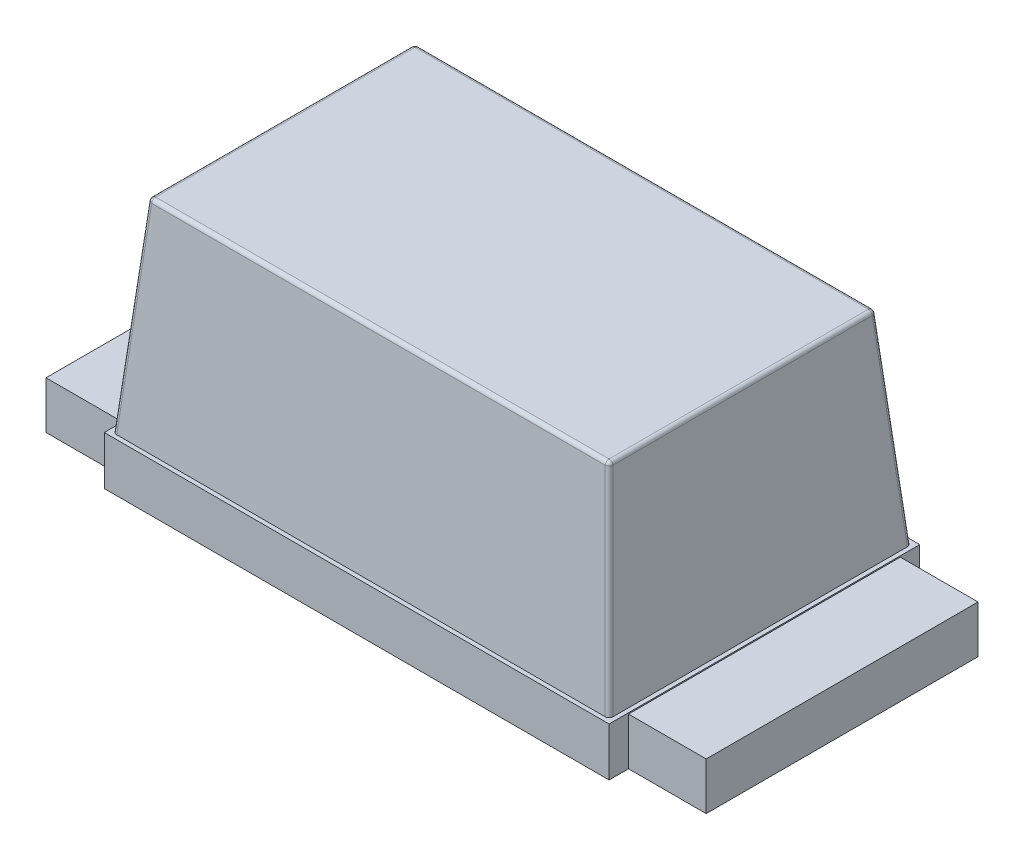
ISO-10303-21;
HEADER;
FILE_DESCRIPTION(('STEP AP214'),'2;1');
FILE_NAME('part.step','',(''),(''),'','','');
FILE_SCHEMA(('AUTOMOTIVE_DESIGN { 1 0 10303 214 1 1 1 1 }'));
ENDSEC;
DATA;
#1=APPLICATION_CONTEXT('core data for automotive mechanical design processes');
#2=APPLICATION_PROTOCOL_DEFINITION('international standard','automotive_design',2000,#1);
#3=PRODUCT_CONTEXT('',#1,'mechanical');
#4=PRODUCT('Part','Part','',(#3));
#5=PRODUCT_RELATED_PRODUCT_CATEGORY('part','',(#4));
#6=PRODUCT_DEFINITION_FORMATION('','',#4);
#7=PRODUCT_DEFINITION_CONTEXT('part definition',#1,'design');
#8=PRODUCT_DEFINITION('design','',#6,#7);
#9=PRODUCT_DEFINITION_SHAPE('','',#8);
#10=(LENGTH_UNIT() NAMED_UNIT(*) SI_UNIT(.MILLI.,.METRE.));
#11=(NAMED_UNIT(*) PLANE_ANGLE_UNIT() SI_UNIT($,.RADIAN.));
#12=(NAMED_UNIT(*) SI_UNIT($,.STERADIAN.) SOLID_ANGLE_UNIT());
#13=UNCERTAINTY_MEASURE_WITH_UNIT(LENGTH_MEASURE(1.E-05),#10,'distance_accuracy_value','');
#14=(GEOMETRIC_REPRESENTATION_CONTEXT(3) GLOBAL_UNCERTAINTY_ASSIGNED_CONTEXT((#13)) GLOBAL_UNIT_ASSIGNED_CONTEXT((#10,
#11,#12)) REPRESENTATION_CONTEXT('',''));
#15=CARTESIAN_POINT('',(0.,0.,0.));
#16=DIRECTION('',(0.,0.,1.));
#17=DIRECTION('',(1.,0.,0.));
#18=AXIS2_PLACEMENT_3D('',#15,#16,#17);
#19=CARTESIAN_POINT('',(1.3,0.125,0.));
#20=DIRECTION('',(-1.,0.,0.));
#21=DIRECTION('',(0.,0.,1.));
#22=AXIS2_PLACEMENT_3D('',#19,#20,#21);
#23=PLANE('',#22);
#24=DIRECTION('',(0.,-1.,0.));
#25=VECTOR('',#24,1.);
#26=CARTESIAN_POINT('',(1.3,0.122,-0.05));
#27=LINE('',#26,#25);
#28=CARTESIAN_POINT('',(1.3,0.122,-0.05));
#29=VERTEX_POINT('',#28);
#30=CARTESIAN_POINT('',(1.3,0.,-0.05));
#31=VERTEX_POINT('',#30);
#32=EDGE_CURVE('E11',#29,#31,#27,.T.);
#33=ORIENTED_EDGE('',*,*,#32,.F.);
#34=DIRECTION('',(0.,0.,1.));
#35=VECTOR('',#34,1.);
#36=CARTESIAN_POINT('',(1.3,0.122,-0.424380225030963));
#37=LINE('',#36,#35);
#38=CARTESIAN_POINT('',(1.3,0.122,-0.75));
#39=VERTEX_POINT('',#38);
#40=EDGE_CURVE('E24',#39,#29,#37,.T.);
#41=ORIENTED_EDGE('',*,*,#40,.F.);
#42=DIRECTION('',(0.,-1.,0.));
#43=VECTOR('',#42,1.);
#44=CARTESIAN_POINT('',(1.3,0.122,-0.75));
#45=LINE('',#44,#43);
#46=CARTESIAN_POINT('',(1.3,0.,-0.75));
#47=VERTEX_POINT('',#46);
#48=EDGE_CURVE('E342',#39,#47,#45,.T.);
#49=ORIENTED_EDGE('',*,*,#48,.T.);
#50=DIRECTION('',(0.,0.,-1.));
#51=VECTOR('',#50,1.);
#52=CARTESIAN_POINT('',(1.3,0.,0.));
#53=LINE('',#52,#51);
#54=CARTESIAN_POINT('',(1.3,0.,-0.799999999999999));
#55=VERTEX_POINT('',#54);
#56=EDGE_CURVE('E340',#47,#55,#53,.T.);
#57=ORIENTED_EDGE('',*,*,#56,.T.);
#58=DIRECTION('',(0.,-1.,0.));
#59=VECTOR('',#58,1.);
#60=CARTESIAN_POINT('',(1.3,0.125,-0.799999999999999));
#61=LINE('',#60,#59);
#62=CARTESIAN_POINT('',(1.3,0.125,-0.799999999999999));
#63=VERTEX_POINT('',#62);
#64=EDGE_CURVE('E337',#63,#55,#61,.T.);
#65=ORIENTED_EDGE('',*,*,#64,.F.);
#66=DIRECTION('',(0.,0.,-1.));
#67=VECTOR('',#66,1.);
#68=CARTESIAN_POINT('',(1.3,0.125,0.));
#69=LINE('',#68,#67);
#70=CARTESIAN_POINT('',(1.3,0.125,0.));
#71=VERTEX_POINT('',#70);
#72=EDGE_CURVE('E334',#71,#63,#69,.T.);
#73=ORIENTED_EDGE('',*,*,#72,.F.);
#74=DIRECTION('',(0.,-1.,0.));
#75=VECTOR('',#74,1.);
#76=CARTESIAN_POINT('',(1.3,0.125,0.));
#77=LINE('',#76,#75);
#78=CARTESIAN_POINT('',(1.3,0.,0.));
#79=VERTEX_POINT('',#78);
#80=EDGE_CURVE('E332',#71,#79,#77,.T.);
#81=ORIENTED_EDGE('',*,*,#80,.T.);
#82=DIRECTION('',(0.,0.,-1.));
#83=VECTOR('',#82,1.);
#84=CARTESIAN_POINT('',(1.3,0.,0.));
#85=LINE('',#84,#83);
#86=EDGE_CURVE('E330',#79,#31,#85,.T.);
#87=ORIENTED_EDGE('',*,*,#86,.T.);
#88=EDGE_LOOP('',(#33,#41,#49,#57,#65,#73,#81,#87));
#89=FACE_BOUND('',#88,.T.);
#90=ADVANCED_FACE('F17',(#89),#23,.F.);
#91=CARTESIAN_POINT('',(0.,0.125,0.));
#92=DIRECTION('',(1.,0.,0.));
#93=DIRECTION('',(0.,0.,-1.));
#94=AXIS2_PLACEMENT_3D('',#91,#92,#93);
#95=PLANE('',#94);
#96=DIRECTION('',(0.,-1.,0.));
#97=VECTOR('',#96,1.);
#98=CARTESIAN_POINT('',(0.,0.122,-0.75));
#99=LINE('',#98,#97);
#100=CARTESIAN_POINT('',(0.,0.122,-0.75));
#101=VERTEX_POINT('',#100);
#102=CARTESIAN_POINT('',(0.,0.,-0.75));
#103=VERTEX_POINT('',#102);
#104=EDGE_CURVE('E328',#101,#103,#99,.T.);
#105=ORIENTED_EDGE('',*,*,#104,.F.);
#106=DIRECTION('',(0.,0.,1.));
#107=VECTOR('',#106,1.);
#108=CARTESIAN_POINT('',(0.,0.122,-0.424380225030963));
#109=LINE('',#108,#107);
#110=CARTESIAN_POINT('',(0.,0.122,-0.0500000000000001));
#111=VERTEX_POINT('',#110);
#112=EDGE_CURVE('E326',#101,#111,#109,.T.);
#113=ORIENTED_EDGE('',*,*,#112,.T.);
#114=DIRECTION('',(0.,-1.,0.));
#115=VECTOR('',#114,1.);
#116=CARTESIAN_POINT('',(0.,0.122,-0.0500000000000001));
#117=LINE('',#116,#115);
#118=CARTESIAN_POINT('',(0.,0.,-0.05));
#119=VERTEX_POINT('',#118);
#120=EDGE_CURVE('E324',#111,#119,#117,.T.);
#121=ORIENTED_EDGE('',*,*,#120,.T.);
#122=DIRECTION('',(0.,0.,1.));
#123=VECTOR('',#122,1.);
#124=CARTESIAN_POINT('',(0.,0.,0.));
#125=LINE('',#124,#123);
#126=CARTESIAN_POINT('',(0.,0.,0.));
#127=VERTEX_POINT('',#126);
#128=EDGE_CURVE('E322',#119,#127,#125,.T.);
#129=ORIENTED_EDGE('',*,*,#128,.T.);
#130=DIRECTION('',(0.,-1.,0.));
#131=VECTOR('',#130,1.);
#132=CARTESIAN_POINT('',(0.,0.125,0.));
#133=LINE('',#132,#131);
#134=CARTESIAN_POINT('',(0.,0.125,0.));
#135=VERTEX_POINT('',#134);
#136=EDGE_CURVE('E319',#135,#127,#133,.T.);
#137=ORIENTED_EDGE('',*,*,#136,.F.);
#138=DIRECTION('',(0.,0.,1.));
#139=VECTOR('',#138,1.);
#140=CARTESIAN_POINT('',(0.,0.125,0.));
#141=LINE('',#140,#139);
#142=CARTESIAN_POINT('',(0.,0.125,-0.799999999999999));
#143=VERTEX_POINT('',#142);
#144=EDGE_CURVE('E316',#143,#135,#141,.T.);
#145=ORIENTED_EDGE('',*,*,#144,.F.);
#146=DIRECTION('',(0.,-1.,0.));
#147=VECTOR('',#146,1.);
#148=CARTESIAN_POINT('',(0.,0.125,-0.799999999999999));
#149=LINE('',#148,#147);
#150=CARTESIAN_POINT('',(0.,0.,-0.799999999999999));
#151=VERTEX_POINT('',#150);
#152=EDGE_CURVE('E314',#143,#151,#149,.T.);
#153=ORIENTED_EDGE('',*,*,#152,.T.);
#154=DIRECTION('',(0.,0.,1.));
#155=VECTOR('',#154,1.);
#156=CARTESIAN_POINT('',(0.,0.,0.));
#157=LINE('',#156,#155);
#158=EDGE_CURVE('E311',#151,#103,#157,.T.);
#159=ORIENTED_EDGE('',*,*,#158,.T.);
#160=EDGE_LOOP('',(#105,#113,#121,#129,#137,#145,#153,#159));
#161=FACE_BOUND('',#160,.T.);
#162=ADVANCED_FACE('F362',(#161),#95,.F.);
#163=CARTESIAN_POINT('',(0.,0.125,0.));
#164=DIRECTION('',(0.,0.,-1.));
#165=DIRECTION('',(-1.,0.,0.));
#166=AXIS2_PLACEMENT_3D('',#163,#164,#165);
#167=PLANE('',#166);
#168=DIRECTION('',(1.,0.,0.));
#169=VECTOR('',#168,1.);
#170=CARTESIAN_POINT('',(0.,0.,0.));
#171=LINE('',#170,#169);
#172=EDGE_CURVE('E308',#127,#79,#171,.T.);
#173=ORIENTED_EDGE('',*,*,#172,.T.);
#174=ORIENTED_EDGE('',*,*,#80,.F.);
#175=DIRECTION('',(1.,0.,0.));
#176=VECTOR('',#175,1.);
#177=CARTESIAN_POINT('',(0.,0.125,0.));
#178=LINE('',#177,#176);
#179=EDGE_CURVE('E305',#135,#71,#178,.T.);
#180=ORIENTED_EDGE('',*,*,#179,.F.);
#181=ORIENTED_EDGE('',*,*,#136,.T.);
#182=EDGE_LOOP('',(#173,#174,#180,#181));
#183=FACE_BOUND('',#182,.T.);
#184=ADVANCED_FACE('F366',(#183),#167,.F.);
#185=CARTESIAN_POINT('',(0.,0.125,-0.799999999999999));
#186=DIRECTION('',(0.,0.,1.));
#187=DIRECTION('',(1.,0.,0.));
#188=AXIS2_PLACEMENT_3D('',#185,#186,#187);
#189=PLANE('',#188);
#190=DIRECTION('',(-1.,0.,0.));
#191=VECTOR('',#190,1.);
#192=CARTESIAN_POINT('',(0.,0.,-0.799999999999999));
#193=LINE('',#192,#191);
#194=EDGE_CURVE('E302',#55,#151,#193,.T.);
#195=ORIENTED_EDGE('',*,*,#194,.T.);
#196=ORIENTED_EDGE('',*,*,#152,.F.);
#197=DIRECTION('',(-1.,0.,0.));
#198=VECTOR('',#197,1.);
#199=CARTESIAN_POINT('',(0.,0.125,-0.799999999999999));
#200=LINE('',#199,#198);
#201=EDGE_CURVE('E299',#63,#143,#200,.T.);
#202=ORIENTED_EDGE('',*,*,#201,.F.);
#203=ORIENTED_EDGE('',*,*,#64,.T.);
#204=EDGE_LOOP('',(#195,#196,#202,#203));
#205=FACE_BOUND('',#204,.T.);
#206=ADVANCED_FACE('F371',(#205),#189,.F.);
#207=CARTESIAN_POINT('',(0.,0.125,-0.799999999999999));
#208=DIRECTION('',(0.,-1.,0.));
#209=DIRECTION('',(0.,0.,-1.));
#210=AXIS2_PLACEMENT_3D('',#207,#208,#209);
#211=PLANE('',#210);
#212=DIRECTION('',(0.,0.,-1.));
#213=VECTOR('',#212,1.);
#214=CARTESIAN_POINT('',(1.289,0.125,-0.788999999999999));
#215=LINE('',#214,#213);
#216=CARTESIAN_POINT('',(1.289,0.125,-0.0209619469809176));
#217=VERTEX_POINT('',#216);
#218=CARTESIAN_POINT('',(1.289,0.125,-0.779038053019081));
#219=VERTEX_POINT('',#218);
#220=EDGE_CURVE('E294',#217,#219,#215,.T.);
#221=ORIENTED_EDGE('',*,*,#220,.F.);
#222=CARTESIAN_POINT('',(1.289,0.125,-0.0209619469809176));
#223=CARTESIAN_POINT('',(1.289,0.125,-0.015117230643747));
#224=CARTESIAN_POINT('',(1.28488276935626,0.125,-0.0110000000000001));
#225=CARTESIAN_POINT('',(1.27903805301909,0.125,-0.0110000000000002));
#226=(BOUNDED_CURVE() B_SPLINE_CURVE(3,(#222,#223,#224,#225),.UNSPECIFIED.,.F.,
.F.) B_SPLINE_CURVE_WITH_KNOTS((4,4),(2.35999258846562,3.92319271871396),
.UNSPECIFIED.) CURVE() GEOMETRIC_REPRESENTATION_ITEM() RATIONAL_B_SPLINE_CURVE((1.,
0.806524890385347,0.806524890385347,1.)) REPRESENTATION_ITEM(''));
#227=CARTESIAN_POINT('',(1.27903805301909,0.125,-0.0110000000000002));
#228=VERTEX_POINT('',#227);
#229=EDGE_CURVE('E290',#217,#228,#226,.T.);
#230=ORIENTED_EDGE('',*,*,#229,.T.);
#231=DIRECTION('',(1.,0.,0.));
#232=VECTOR('',#231,1.);
#233=CARTESIAN_POINT('',(0.011,0.125,-0.011));
#234=LINE('',#233,#232);
#235=CARTESIAN_POINT('',(0.0209619469809174,0.125,-0.011));
#236=VERTEX_POINT('',#235);
#237=EDGE_CURVE('E284',#236,#228,#234,.T.);
#238=ORIENTED_EDGE('',*,*,#237,.F.);
#239=CARTESIAN_POINT('',(0.0209619469809174,0.125,-0.011));
#240=CARTESIAN_POINT('',(0.0151172306437469,0.125,-0.011));
#241=CARTESIAN_POINT('',(0.011,0.125,-0.0151172306437468));
#242=CARTESIAN_POINT('',(0.011,0.125,-0.0209619469809174));
#243=(BOUNDED_CURVE() B_SPLINE_CURVE(3,(#239,#240,#241,#242),.UNSPECIFIED.,.F.,
.F.) B_SPLINE_CURVE_WITH_KNOTS((4,4),(2.35999258846563,3.92319271871396),
.UNSPECIFIED.) CURVE() GEOMETRIC_REPRESENTATION_ITEM() RATIONAL_B_SPLINE_CURVE((1.,
0.806524890385349,0.806524890385349,1.)) REPRESENTATION_ITEM(''));
#244=CARTESIAN_POINT('',(0.011,0.125,-0.0209619469809174));
#245=VERTEX_POINT('',#244);
#246=EDGE_CURVE('E280',#236,#245,#243,.T.);
#247=ORIENTED_EDGE('',*,*,#246,.T.);
#248=DIRECTION('',(0.,0.,1.));
#249=VECTOR('',#248,1.);
#250=CARTESIAN_POINT('',(0.011,0.125,-0.788999999999999));
#251=LINE('',#250,#249);
#252=CARTESIAN_POINT('',(0.011,0.125,-0.779038053019081));
#253=VERTEX_POINT('',#252);
#254=EDGE_CURVE('E274',#253,#245,#251,.T.);
#255=ORIENTED_EDGE('',*,*,#254,.F.);
#256=CARTESIAN_POINT('',(0.011,0.125,-0.779038053019081));
#257=CARTESIAN_POINT('',(0.011,0.125,-0.784882769356252));
#258=CARTESIAN_POINT('',(0.0151172306437469,0.125,-0.788999999999999));
#259=CARTESIAN_POINT('',(0.0209619469809174,0.125,-0.788999999999999));
#260=(BOUNDED_CURVE() B_SPLINE_CURVE(3,(#256,#257,#258,#259),.UNSPECIFIED.,.F.,
.F.) B_SPLINE_CURVE_WITH_KNOTS((4,4),(2.35999258846562,3.92319271871396),
.UNSPECIFIED.) CURVE() GEOMETRIC_REPRESENTATION_ITEM() RATIONAL_B_SPLINE_CURVE((1.,
0.806524890385348,0.806524890385348,1.)) REPRESENTATION_ITEM(''));
#261=CARTESIAN_POINT('',(0.0209619469809174,0.125,-0.788999999999999));
#262=VERTEX_POINT('',#261);
#263=EDGE_CURVE('E270',#253,#262,#260,.T.);
#264=ORIENTED_EDGE('',*,*,#263,.T.);
#265=DIRECTION('',(-1.,0.,0.));
#266=VECTOR('',#265,1.);
#267=CARTESIAN_POINT('',(0.011,0.125,-0.788999999999999));
#268=LINE('',#267,#266);
#269=CARTESIAN_POINT('',(1.27903805301909,0.125,-0.788999999999999));
#270=VERTEX_POINT('',#269);
#271=EDGE_CURVE('E264',#270,#262,#268,.T.);
#272=ORIENTED_EDGE('',*,*,#271,.F.);
#273=CARTESIAN_POINT('',(1.27903805301909,0.125,-0.788999999999999));
#274=CARTESIAN_POINT('',(1.28488276935626,0.125,-0.788999999999999));
#275=CARTESIAN_POINT('',(1.289,0.125,-0.784882769356252));
#276=CARTESIAN_POINT('',(1.289,0.125,-0.779038053019081));
#277=(BOUNDED_CURVE() B_SPLINE_CURVE(3,(#273,#274,#275,#276),.UNSPECIFIED.,.F.,
.F.) B_SPLINE_CURVE_WITH_KNOTS((4,4),(2.35999258846562,3.92319271871396),
.UNSPECIFIED.) CURVE() GEOMETRIC_REPRESENTATION_ITEM() RATIONAL_B_SPLINE_CURVE((1.,
0.806524890385347,0.806524890385347,1.)) REPRESENTATION_ITEM(''));
#278=EDGE_CURVE('E259',#270,#219,#277,.T.);
#279=ORIENTED_EDGE('',*,*,#278,.T.);
#280=EDGE_LOOP('',(#221,#230,#238,#247,#255,#264,#272,#279));
#281=FACE_BOUND('',#280,.T.);
#282=ORIENTED_EDGE('',*,*,#144,.T.);
#283=ORIENTED_EDGE('',*,*,#179,.T.);
#284=ORIENTED_EDGE('',*,*,#72,.T.);
#285=ORIENTED_EDGE('',*,*,#201,.T.);
#286=EDGE_LOOP('',(#282,#283,#284,#285));
#287=FACE_BOUND('',#286,.T.);
#288=ADVANCED_FACE('F377',(#281,#287),#211,.F.);
#289=CARTESIAN_POINT('',(0.,0.,-0.799999999999999));
#290=DIRECTION('',(0.,-1.,0.));
#291=DIRECTION('',(0.,0.,-1.));
#292=AXIS2_PLACEMENT_3D('',#289,#290,#291);
#293=PLANE('',#292);
#294=ORIENTED_EDGE('',*,*,#158,.F.);
#295=ORIENTED_EDGE('',*,*,#194,.F.);
#296=ORIENTED_EDGE('',*,*,#56,.F.);
#297=DIRECTION('',(-1.,0.,0.));
#298=VECTOR('',#297,1.);
#299=CARTESIAN_POINT('',(-0.937065960260598,0.,-0.75));
#300=LINE('',#299,#298);
#301=CARTESIAN_POINT('',(1.5,0.,-0.75));
#302=VERTEX_POINT('',#301);
#303=EDGE_CURVE('E256',#302,#47,#300,.T.);
#304=ORIENTED_EDGE('',*,*,#303,.F.);
#305=DIRECTION('',(0.,0.,1.));
#306=VECTOR('',#305,1.);
#307=CARTESIAN_POINT('',(1.5,0.,-0.424380225030963));
#308=LINE('',#307,#306);
#309=CARTESIAN_POINT('',(1.5,0.,-0.05));
#310=VERTEX_POINT('',#309);
#311=EDGE_CURVE('E254',#302,#310,#308,.T.);
#312=ORIENTED_EDGE('',*,*,#311,.T.);
#313=DIRECTION('',(1.,0.,0.));
#314=VECTOR('',#313,1.);
#315=CARTESIAN_POINT('',(-0.937065960260598,0.,-0.0500000000000004));
#316=LINE('',#315,#314);
#317=EDGE_CURVE('E177',#31,#310,#316,.T.);
#318=ORIENTED_EDGE('',*,*,#317,.F.);
#319=ORIENTED_EDGE('',*,*,#86,.F.);
#320=ORIENTED_EDGE('',*,*,#172,.F.);
#321=ORIENTED_EDGE('',*,*,#128,.F.);
#322=DIRECTION('',(-1.,0.,0.));
#323=VECTOR('',#322,1.);
#324=CARTESIAN_POINT('',(-0.937065960260598,0.,-0.0499999999999999));
#325=LINE('',#324,#323);
#326=CARTESIAN_POINT('',(-0.2,0.,-0.05));
#327=VERTEX_POINT('',#326);
#328=EDGE_CURVE('E251',#119,#327,#325,.T.);
#329=ORIENTED_EDGE('',*,*,#328,.T.);
#330=DIRECTION('',(0.,0.,1.));
#331=VECTOR('',#330,1.);
#332=CARTESIAN_POINT('',(-0.2,0.,-0.424380225030963));
#333=LINE('',#332,#331);
#334=CARTESIAN_POINT('',(-0.2,0.,-0.75));
#335=VERTEX_POINT('',#334);
#336=EDGE_CURVE('E248',#335,#327,#333,.T.);
#337=ORIENTED_EDGE('',*,*,#336,.F.);
#338=DIRECTION('',(1.,0.,0.));
#339=VECTOR('',#338,1.);
#340=CARTESIAN_POINT('',(-0.937065960260598,0.,-0.75));
#341=LINE('',#340,#339);
#342=EDGE_CURVE('E245',#335,#103,#341,.T.);
#343=ORIENTED_EDGE('',*,*,#342,.T.);
#344=EDGE_LOOP('',(#294,#295,#296,#304,#312,#318,#319,#320,#321,#329,#337,#343));
#345=FACE_BOUND('',#344,.T.);
#346=ADVANCED_FACE('F349',(#345),#293,.T.);
#347=CARTESIAN_POINT('',(0.011,0.65,-0.011));
#348=DIRECTION('',(0.,1.,0.));
#349=DIRECTION('',(0.,0.,1.));
#350=AXIS2_PLACEMENT_3D('',#347,#348,#349);
#351=PLANE('',#350);
#352=DIRECTION('',(0.,0.,-1.));
#353=VECTOR('',#352,1.);
#354=CARTESIAN_POINT('',(1.23390513990872,0.65,-0.011));
#355=LINE('',#354,#353);
#356=CARTESIAN_POINT('',(1.23390513990872,0.65,-0.0660948600912845));
#357=VERTEX_POINT('',#356);
#358=CARTESIAN_POINT('',(1.23390513990872,0.65,-0.733905139908714));
#359=VERTEX_POINT('',#358);
#360=EDGE_CURVE('E243',#357,#359,#355,.T.);
#361=ORIENTED_EDGE('',*,*,#360,.T.);
#362=DIRECTION('',(-1.,0.,0.));
#363=VECTOR('',#362,1.);
#364=CARTESIAN_POINT('',(0.0109999999999999,0.65,-0.733905139908714));
#365=LINE('',#364,#363);
#366=CARTESIAN_POINT('',(0.0660948600912843,0.65,-0.733905139908714));
#367=VERTEX_POINT('',#366);
#368=EDGE_CURVE('E241',#359,#367,#365,.T.);
#369=ORIENTED_EDGE('',*,*,#368,.T.);
#370=DIRECTION('',(0.,0.,1.));
#371=VECTOR('',#370,1.);
#372=CARTESIAN_POINT('',(0.0660948600912843,0.65,-0.011));
#373=LINE('',#372,#371);
#374=CARTESIAN_POINT('',(0.0660948600912843,0.65,-0.0660948600912843));
#375=VERTEX_POINT('',#374);
#376=EDGE_CURVE('E239',#367,#375,#373,.T.);
#377=ORIENTED_EDGE('',*,*,#376,.T.);
#378=DIRECTION('',(1.,0.,0.));
#379=VECTOR('',#378,1.);
#380=CARTESIAN_POINT('',(0.011,0.65,-0.0660948600912843));
#381=LINE('',#380,#379);
#382=EDGE_CURVE('E236',#375,#357,#381,.T.);
#383=ORIENTED_EDGE('',*,*,#382,.T.);
#384=EDGE_LOOP('',(#361,#369,#377,#383));
#385=FACE_BOUND('',#384,.T.);
#386=ADVANCED_FACE('F384',(#385),#351,.T.);
#387=CARTESIAN_POINT('',(0.011,0.125,-0.011));
#388=DIRECTION('',(0.,0.0871557427476582,0.996194698091746));
#389=DIRECTION('',(0.,-0.996194698091746,0.0871557427476582));
#390=AXIS2_PLACEMENT_3D('',#387,#388,#389);
#391=PLANE('',#390);
#392=ORIENTED_EDGE('',*,*,#237,.T.);
#393=DIRECTION('',(-0.0868265938642476,0.992432509138967,-0.0868265938642476));
#394=VECTOR('',#393,1.);
#395=CARTESIAN_POINT('',(1.26947849495698,0.23426624864115,-0.0205595580621057));
#396=LINE('',#395,#394);
#397=CARTESIAN_POINT('',(1.23390513990872,0.640871557427477,-0.056132913110367));
#398=VERTEX_POINT('',#397);
#399=EDGE_CURVE('E234',#228,#398,#396,.T.);
#400=ORIENTED_EDGE('',*,*,#399,.T.);
#401=DIRECTION('',(-1.,0.,0.));
#402=VECTOR('',#401,1.);
#403=CARTESIAN_POINT('',(0.011,0.640871557427477,-0.0561329131103669));
#404=LINE('',#403,#402);
#405=CARTESIAN_POINT('',(0.0660948600912843,0.640871557427477,-0.0561329131103669));
#406=VERTEX_POINT('',#405);
#407=EDGE_CURVE('E232',#398,#406,#404,.T.);
#408=ORIENTED_EDGE('',*,*,#407,.T.);
#409=DIRECTION('',(-0.0868265938642476,-0.992432509138967,0.0868265938642476));
#410=VECTOR('',#409,1.);
#411=CARTESIAN_POINT('',(0.0208868452831814,0.12414158366685,-0.0109248983022639));
#412=LINE('',#411,#410);
#413=EDGE_CURVE('E229',#406,#236,#412,.T.);
#414=ORIENTED_EDGE('',*,*,#413,.T.);
#415=EDGE_LOOP('',(#392,#400,#408,#414));
#416=FACE_BOUND('',#415,.T.);
#417=ADVANCED_FACE('F387',(#416),#391,.T.);
#418=CARTESIAN_POINT('',(1.289,0.125,-0.788999999999999));
#419=DIRECTION('',(0.996194698091746,0.0871557427476582,0.));
#420=DIRECTION('',(-0.0871557427476582,0.996194698091746,0.));
#421=AXIS2_PLACEMENT_3D('',#418,#419,#420);
#422=PLANE('',#421);
#423=DIRECTION('',(0.,0.,1.));
#424=VECTOR('',#423,1.);
#425=CARTESIAN_POINT('',(1.24386708688964,0.640871557427477,-0.788999999999999));
#426=LINE('',#425,#424);
#427=CARTESIAN_POINT('',(1.24386708688964,0.640871557427477,-0.733905139908714));
#428=VERTEX_POINT('',#427);
#429=CARTESIAN_POINT('',(1.24386708688964,0.640871557427477,-0.0660948600912845));
#430=VERTEX_POINT('',#429);
#431=EDGE_CURVE('E227',#428,#430,#426,.T.);
#432=ORIENTED_EDGE('',*,*,#431,.T.);
#433=DIRECTION('',(0.0868265938642476,-0.992432509138967,0.0868265938642476));
#434=VECTOR('',#433,1.);
#435=CARTESIAN_POINT('',(1.28320987063893,0.191181481436807,-0.0267520763419897));
#436=LINE('',#435,#434);
#437=EDGE_CURVE('E224',#430,#217,#436,.T.);
#438=ORIENTED_EDGE('',*,*,#437,.T.);
#439=ORIENTED_EDGE('',*,*,#220,.T.);
#440=DIRECTION('',(-0.0868265938642476,0.992432509138967,0.0868265938642477));
#441=VECTOR('',#440,1.);
#442=CARTESIAN_POINT('',(1.28907510169774,0.12414158366685,-0.779113154716817));
#443=LINE('',#442,#441);
#444=EDGE_CURVE('E221',#219,#428,#443,.T.);
#445=ORIENTED_EDGE('',*,*,#444,.T.);
#446=EDGE_LOOP('',(#432,#438,#439,#445));
#447=FACE_BOUND('',#446,.T.);
#448=ADVANCED_FACE('F391',(#447),#422,.T.);
#449=CARTESIAN_POINT('',(0.011,0.125,-0.788999999999999));
#450=DIRECTION('',(0.,0.0871557427476582,-0.996194698091746));
#451=DIRECTION('',(0.,0.996194698091746,0.0871557427476582));
#452=AXIS2_PLACEMENT_3D('',#449,#450,#451);
#453=PLANE('',#452);
#454=DIRECTION('',(1.,0.,0.));
#455=VECTOR('',#454,1.);
#456=CARTESIAN_POINT('',(0.011,0.640871557427477,-0.743867086889632));
#457=LINE('',#456,#455);
#458=CARTESIAN_POINT('',(0.0660948600912843,0.640871557427477,-0.743867086889632));
#459=VERTEX_POINT('',#458);
#460=CARTESIAN_POINT('',(1.23390513990872,0.640871557427477,-0.743867086889632));
#461=VERTEX_POINT('',#460);
#462=EDGE_CURVE('E219',#459,#461,#457,.T.);
#463=ORIENTED_EDGE('',*,*,#462,.T.);
#464=DIRECTION('',(0.0868265938642476,-0.992432509138967,-0.0868265938642476));
#465=VECTOR('',#464,1.);
#466=CARTESIAN_POINT('',(1.26947849495698,0.23426624864115,-0.779440441937893));
#467=LINE('',#466,#465);
#468=EDGE_CURVE('E216',#461,#270,#467,.T.);
#469=ORIENTED_EDGE('',*,*,#468,.T.);
#470=ORIENTED_EDGE('',*,*,#271,.T.);
#471=DIRECTION('',(0.0868265938642476,0.992432509138967,0.0868265938642476));
#472=VECTOR('',#471,1.);
#473=CARTESIAN_POINT('',(0.0208868452831814,0.12414158366685,-0.789075101697735));
#474=LINE('',#473,#472);
#475=EDGE_CURVE('E213',#262,#459,#474,.T.);
#476=ORIENTED_EDGE('',*,*,#475,.T.);
#477=EDGE_LOOP('',(#463,#469,#470,#476));
#478=FACE_BOUND('',#477,.T.);
#479=ADVANCED_FACE('F395',(#478),#453,.T.);
#480=CARTESIAN_POINT('',(0.011,0.125,-0.788999999999999));
#481=DIRECTION('',(-0.996194698091746,0.0871557427476582,0.));
#482=DIRECTION('',(-0.0871557427476582,-0.996194698091746,0.));
#483=AXIS2_PLACEMENT_3D('',#480,#481,#482);
#484=PLANE('',#483);
#485=DIRECTION('',(0.,0.,-1.));
#486=VECTOR('',#485,1.);
#487=CARTESIAN_POINT('',(0.0561329131103669,0.640871557427477,-0.788999999999999));
#488=LINE('',#487,#486);
#489=CARTESIAN_POINT('',(0.0561329131103669,0.640871557427477,-0.0660948600912843));
#490=VERTEX_POINT('',#489);
#491=CARTESIAN_POINT('',(0.0561329131103669,0.640871557427477,-0.733905139908714));
#492=VERTEX_POINT('',#491);
#493=EDGE_CURVE('E211',#490,#492,#488,.T.);
#494=ORIENTED_EDGE('',*,*,#493,.T.);
#495=DIRECTION('',(-0.0868265938642476,-0.992432509138967,-0.0868265938642476));
#496=VECTOR('',#495,1.);
#497=CARTESIAN_POINT('',(0.0109248983022639,0.12414158366685,-0.779113154716817));
#498=LINE('',#497,#496);
#499=EDGE_CURVE('E208',#492,#253,#498,.T.);
#500=ORIENTED_EDGE('',*,*,#499,.T.);
#501=ORIENTED_EDGE('',*,*,#254,.T.);
#502=DIRECTION('',(0.0868265938642476,0.992432509138967,-0.0868265938642477));
#503=VECTOR('',#502,1.);
#504=CARTESIAN_POINT('',(0.016790129361072,0.191181481436807,-0.0267520763419895));
#505=LINE('',#504,#503);
#506=EDGE_CURVE('E205',#245,#490,#505,.T.);
#507=ORIENTED_EDGE('',*,*,#506,.T.);
#508=EDGE_LOOP('',(#494,#500,#501,#507));
#509=FACE_BOUND('',#508,.T.);
#510=ADVANCED_FACE('F399',(#509),#484,.T.);
#511=CARTESIAN_POINT('',(-0.937065960260598,0.122,-0.75));
#512=DIRECTION('',(0.,0.,-1.));
#513=DIRECTION('',(-1.,0.,0.));
#514=AXIS2_PLACEMENT_3D('',#511,#512,#513);
#515=PLANE('',#514);
#516=ORIENTED_EDGE('',*,*,#342,.F.);
#517=DIRECTION('',(0.,-1.,0.));
#518=VECTOR('',#517,1.);
#519=CARTESIAN_POINT('',(-0.2,0.122,-0.75));
#520=LINE('',#519,#518);
#521=CARTESIAN_POINT('',(-0.2,0.122,-0.75));
#522=VERTEX_POINT('',#521);
#523=EDGE_CURVE('E202',#522,#335,#520,.T.);
#524=ORIENTED_EDGE('',*,*,#523,.F.);
#525=DIRECTION('',(1.,0.,0.));
#526=VECTOR('',#525,1.);
#527=CARTESIAN_POINT('',(-0.937065960260598,0.122,-0.75));
#528=LINE('',#527,#526);
#529=EDGE_CURVE('E199',#522,#101,#528,.T.);
#530=ORIENTED_EDGE('',*,*,#529,.T.);
#531=ORIENTED_EDGE('',*,*,#104,.T.);
#532=EDGE_LOOP('',(#516,#524,#530,#531));
#533=FACE_BOUND('',#532,.T.);
#534=ADVANCED_FACE('F403',(#533),#515,.T.);
#535=CARTESIAN_POINT('',(-0.2,0.122,-0.424380225030963));
#536=DIRECTION('',(1.,0.,0.));
#537=DIRECTION('',(0.,0.,-1.));
#538=AXIS2_PLACEMENT_3D('',#535,#536,#537);
#539=PLANE('',#538);
#540=ORIENTED_EDGE('',*,*,#336,.T.);
#541=DIRECTION('',(0.,-1.,0.));
#542=VECTOR('',#541,1.);
#543=CARTESIAN_POINT('',(-0.2,0.122,-0.05));
#544=LINE('',#543,#542);
#545=CARTESIAN_POINT('',(-0.2,0.122,-0.05));
#546=VERTEX_POINT('',#545);
#547=EDGE_CURVE('E196',#546,#327,#544,.T.);
#548=ORIENTED_EDGE('',*,*,#547,.F.);
#549=DIRECTION('',(0.,0.,1.));
#550=VECTOR('',#549,1.);
#551=CARTESIAN_POINT('',(-0.2,0.122,-0.424380225030963));
#552=LINE('',#551,#550);
#553=EDGE_CURVE('E193',#522,#546,#552,.T.);
#554=ORIENTED_EDGE('',*,*,#553,.F.);
#555=ORIENTED_EDGE('',*,*,#523,.T.);
#556=EDGE_LOOP('',(#540,#548,#554,#555));
#557=FACE_BOUND('',#556,.T.);
#558=ADVANCED_FACE('F407',(#557),#539,.F.);
#559=CARTESIAN_POINT('',(-0.937065960260598,0.122,-0.0499999999999999));
#560=DIRECTION('',(0.,0.,1.));
#561=DIRECTION('',(1.,0.,0.));
#562=AXIS2_PLACEMENT_3D('',#559,#560,#561);
#563=PLANE('',#562);
#564=ORIENTED_EDGE('',*,*,#328,.F.);
#565=ORIENTED_EDGE('',*,*,#120,.F.);
#566=DIRECTION('',(-1.,0.,0.));
#567=VECTOR('',#566,1.);
#568=CARTESIAN_POINT('',(-0.937065960260598,0.122,-0.0499999999999999));
#569=LINE('',#568,#567);
#570=EDGE_CURVE('E190',#111,#546,#569,.T.);
#571=ORIENTED_EDGE('',*,*,#570,.T.);
#572=ORIENTED_EDGE('',*,*,#547,.T.);
#573=EDGE_LOOP('',(#564,#565,#571,#572));
#574=FACE_BOUND('',#573,.T.);
#575=ADVANCED_FACE('F411',(#574),#563,.T.);
#576=CARTESIAN_POINT('',(-0.937065960260598,0.122,-0.424380225030963));
#577=DIRECTION('',(0.,1.,0.));
#578=DIRECTION('',(0.,0.,1.));
#579=AXIS2_PLACEMENT_3D('',#576,#577,#578);
#580=PLANE('',#579);
#581=ORIENTED_EDGE('',*,*,#112,.F.);
#582=ORIENTED_EDGE('',*,*,#529,.F.);
#583=ORIENTED_EDGE('',*,*,#553,.T.);
#584=ORIENTED_EDGE('',*,*,#570,.F.);
#585=EDGE_LOOP('',(#581,#582,#583,#584));
#586=FACE_BOUND('',#585,.T.);
#587=ADVANCED_FACE('F359',(#586),#580,.T.);
#588=CARTESIAN_POINT('',(1.5,0.122,-0.424380225030963));
#589=DIRECTION('',(1.,0.,0.));
#590=DIRECTION('',(0.,0.,-1.));
#591=AXIS2_PLACEMENT_3D('',#588,#589,#590);
#592=PLANE('',#591);
#593=ORIENTED_EDGE('',*,*,#311,.F.);
#594=DIRECTION('',(0.,-1.,0.));
#595=VECTOR('',#594,1.);
#596=CARTESIAN_POINT('',(1.5,0.122,-0.75));
#597=LINE('',#596,#595);
#598=CARTESIAN_POINT('',(1.5,0.122,-0.75));
#599=VERTEX_POINT('',#598);
#600=EDGE_CURVE('E168',#599,#302,#597,.T.);
#601=ORIENTED_EDGE('',*,*,#600,.F.);
#602=DIRECTION('',(0.,0.,1.));
#603=VECTOR('',#602,1.);
#604=CARTESIAN_POINT('',(1.5,0.122,-0.424380225030963));
#605=LINE('',#604,#603);
#606=CARTESIAN_POINT('',(1.5,0.122,-0.05));
#607=VERTEX_POINT('',#606);
#608=EDGE_CURVE('E162',#599,#607,#605,.T.);
#609=ORIENTED_EDGE('',*,*,#608,.T.);
#610=DIRECTION('',(0.,-1.,0.));
#611=VECTOR('',#610,1.);
#612=CARTESIAN_POINT('',(1.5,0.122,-0.05));
#613=LINE('',#612,#611);
#614=EDGE_CURVE('E166',#607,#310,#613,.T.);
#615=ORIENTED_EDGE('',*,*,#614,.T.);
#616=EDGE_LOOP('',(#593,#601,#609,#615));
#617=FACE_BOUND('',#616,.T.);
#618=ADVANCED_FACE('F165',(#617),#592,.T.);
#619=CARTESIAN_POINT('',(-0.937065960260598,0.122,-0.75));
#620=DIRECTION('',(0.,0.,1.));
#621=DIRECTION('',(1.,0.,0.));
#622=AXIS2_PLACEMENT_3D('',#619,#620,#621);
#623=PLANE('',#622);
#624=ORIENTED_EDGE('',*,*,#303,.T.);
#625=ORIENTED_EDGE('',*,*,#48,.F.);
#626=DIRECTION('',(-1.,0.,0.));
#627=VECTOR('',#626,1.);
#628=CARTESIAN_POINT('',(-0.937065960260598,0.122,-0.75));
#629=LINE('',#628,#627);
#630=EDGE_CURVE('E178',#599,#39,#629,.T.);
#631=ORIENTED_EDGE('',*,*,#630,.F.);
#632=ORIENTED_EDGE('',*,*,#600,.T.);
#633=EDGE_LOOP('',(#624,#625,#631,#632));
#634=FACE_BOUND('',#633,.T.);
#635=ADVANCED_FACE('F350',(#634),#623,.F.);
#636=CARTESIAN_POINT('',(-0.937065960260598,0.122,-0.0500000000000004));
#637=DIRECTION('',(0.,0.,-1.));
#638=DIRECTION('',(-1.,0.,0.));
#639=AXIS2_PLACEMENT_3D('',#636,#637,#638);
#640=PLANE('',#639);
#641=ORIENTED_EDGE('',*,*,#317,.T.);
#642=ORIENTED_EDGE('',*,*,#614,.F.);
#643=DIRECTION('',(1.,0.,0.));
#644=VECTOR('',#643,1.);
#645=CARTESIAN_POINT('',(-0.937065960260598,0.122,-0.0500000000000004));
#646=LINE('',#645,#644);
#647=EDGE_CURVE('E175',#29,#607,#646,.T.);
#648=ORIENTED_EDGE('',*,*,#647,.F.);
#649=ORIENTED_EDGE('',*,*,#32,.T.);
#650=EDGE_LOOP('',(#641,#642,#648,#649));
#651=FACE_BOUND('',#650,.T.);
#652=ADVANCED_FACE('F174',(#651),#640,.F.);
#653=CARTESIAN_POINT('',(-0.937065960260598,0.122,-0.424380225030963));
#654=DIRECTION('',(0.,1.,0.));
#655=DIRECTION('',(0.,0.,1.));
#656=AXIS2_PLACEMENT_3D('',#653,#654,#655);
#657=PLANE('',#656);
#658=ORIENTED_EDGE('',*,*,#608,.F.);
#659=ORIENTED_EDGE('',*,*,#630,.T.);
#660=ORIENTED_EDGE('',*,*,#40,.T.);
#661=ORIENTED_EDGE('',*,*,#647,.T.);
#662=EDGE_LOOP('',(#658,#659,#660,#661));
#663=FACE_BOUND('',#662,.T.);
#664=ADVANCED_FACE('F180',(#663),#657,.T.);
#665=CARTESIAN_POINT('',(1.26947849495698,0.233394691213674,-0.0305215050430232));
#666=DIRECTION('',(-0.0868265938642477,0.992432509138967,-0.0868265938642476));
#667=DIRECTION('',(-0.996194698091746,-0.0871557427476582,0.));
#668=AXIS2_PLACEMENT_3D('',#665,#666,#667);
#669=CYLINDRICAL_SURFACE('',#668,0.01);
#670=ORIENTED_EDGE('',*,*,#229,.F.);
#671=ORIENTED_EDGE('',*,*,#437,.F.);
#672=CARTESIAN_POINT('',(1.23390513990872,0.64,-0.0660948600912845));
#673=DIRECTION('',(-0.0868265938642501,0.992432509138967,-0.086826593864252));
#674=DIRECTION('',(0.,0.0871557427476627,0.996194698091745));
#675=AXIS2_PLACEMENT_3D('',#672,#673,#674);
#676=CIRCLE('',#675,0.01);
#677=EDGE_CURVE('E181',#398,#430,#676,.T.);
#678=ORIENTED_EDGE('',*,*,#677,.F.);
#679=ORIENTED_EDGE('',*,*,#399,.F.);
#680=EDGE_LOOP('',(#670,#671,#678,#679));
#681=FACE_BOUND('',#680,.T.);
#682=ADVANCED_FACE('F465',(#681),#669,.T.);
#683=CARTESIAN_POINT('',(0.011,0.64,-0.0660948600912843));
#684=DIRECTION('',(1.,0.,0.));
#685=DIRECTION('',(0.,0.,-1.));
#686=AXIS2_PLACEMENT_3D('',#683,#684,#685);
#687=CYLINDRICAL_SURFACE('',#686,0.01);
#688=CARTESIAN_POINT('',(0.0660948600912843,0.64,-0.0660948600912843));
#689=DIRECTION('',(-1.,0.,0.));
#690=DIRECTION('',(0.,-1.,0.));
#691=AXIS2_PLACEMENT_3D('',#688,#689,#690);
#692=CIRCLE('',#691,0.01);
#693=EDGE_CURVE('E185',#406,#375,#692,.T.);
#694=ORIENTED_EDGE('',*,*,#693,.F.);
#695=ORIENTED_EDGE('',*,*,#407,.F.);
#696=CARTESIAN_POINT('',(1.23390513990872,0.64,-0.0660948600912845));
#697=DIRECTION('',(1.,0.,0.));
#698=DIRECTION('',(0.,0.,-1.));
#699=AXIS2_PLACEMENT_3D('',#696,#697,#698);
#700=CIRCLE('',#699,0.01);
#701=EDGE_CURVE('E622',#357,#398,#700,.T.);
#702=ORIENTED_EDGE('',*,*,#701,.F.);
#703=ORIENTED_EDGE('',*,*,#382,.F.);
#704=EDGE_LOOP('',(#694,#695,#702,#703));
#705=FACE_BOUND('',#704,.T.);
#706=ADVANCED_FACE('F474',(#705),#687,.T.);
#707=CARTESIAN_POINT('',(0.0267520763419895,0.190309924009331,-0.0267520763419895));
#708=DIRECTION('',(0.0868265938642477,0.992432509138967,-0.0868265938642477));
#709=DIRECTION('',(0.,0.0871557427476582,0.996194698091746));
#710=AXIS2_PLACEMENT_3D('',#707,#708,#709);
#711=CYLINDRICAL_SURFACE('',#710,0.01);
#712=ORIENTED_EDGE('',*,*,#246,.F.);
#713=ORIENTED_EDGE('',*,*,#413,.F.);
#714=CARTESIAN_POINT('',(0.0660948600912843,0.64,-0.0660948600912843));
#715=DIRECTION('',(0.086826593864252,0.992432509138966,-0.0868265938642519));
#716=DIRECTION('',(-0.996194698091745,0.0871557427476626,0.));
#717=AXIS2_PLACEMENT_3D('',#714,#715,#716);
#718=CIRCLE('',#717,0.01);
#719=EDGE_CURVE('E619',#490,#406,#718,.T.);
#720=ORIENTED_EDGE('',*,*,#719,.F.);
#721=ORIENTED_EDGE('',*,*,#506,.F.);
#722=EDGE_LOOP('',(#712,#713,#720,#721));
#723=FACE_BOUND('',#722,.T.);
#724=ADVANCED_FACE('F485',(#723),#711,.T.);
#725=CARTESIAN_POINT('',(1.23390513990872,0.64,-0.0660948600912845));
#726=DIRECTION('',(0.,1.,0.));
#727=DIRECTION('',(1.,0.,0.));
#728=AXIS2_PLACEMENT_3D('',#725,#726,#727);
#729=SPHERICAL_SURFACE('',#728,0.01);
#730=ORIENTED_EDGE('',*,*,#701,.T.);
#731=ORIENTED_EDGE('',*,*,#677,.T.);
#732=CARTESIAN_POINT('',(1.23390513990872,0.64,-0.0660948600912845));
#733=DIRECTION('',(0.,0.,-1.));
#734=DIRECTION('',(0.,-1.,0.));
#735=AXIS2_PLACEMENT_3D('',#732,#733,#734);
#736=CIRCLE('',#735,0.01);
#737=EDGE_CURVE('E616',#357,#430,#736,.T.);
#738=ORIENTED_EDGE('',*,*,#737,.F.);
#739=EDGE_LOOP('',(#730,#731,#738));
#740=FACE_BOUND('',#739,.T.);
#741=ADVANCED_FACE('F495',(#740),#729,.T.);
#742=CARTESIAN_POINT('',(0.0660948600912843,0.64,-0.0660948600912843));
#743=DIRECTION('',(0.,1.,0.));
#744=DIRECTION('',(1.,0.,0.));
#745=AXIS2_PLACEMENT_3D('',#742,#743,#744);
#746=SPHERICAL_SURFACE('',#745,0.01);
#747=ORIENTED_EDGE('',*,*,#719,.T.);
#748=ORIENTED_EDGE('',*,*,#693,.T.);
#749=CARTESIAN_POINT('',(0.0660948600912843,0.64,-0.0660948600912843));
#750=DIRECTION('',(0.,0.,-1.));
#751=DIRECTION('',(1.,0.,0.));
#752=AXIS2_PLACEMENT_3D('',#749,#750,#751);
#753=CIRCLE('',#752,0.01);
#754=EDGE_CURVE('E613',#490,#375,#753,.T.);
#755=ORIENTED_EDGE('',*,*,#754,.F.);
#756=EDGE_LOOP('',(#747,#748,#755));
#757=FACE_BOUND('',#756,.T.);
#758=ADVANCED_FACE('F505',(#757),#746,.T.);
#759=CARTESIAN_POINT('',(1.27911315471682,0.123270026239374,-0.779113154716817));
#760=DIRECTION('',(-0.0868265938642477,0.992432509138967,0.0868265938642477));
#761=DIRECTION('',(0.,-0.0871557427476582,0.996194698091746));
#762=AXIS2_PLACEMENT_3D('',#759,#760,#761);
#763=CYLINDRICAL_SURFACE('',#762,0.01);
#764=ORIENTED_EDGE('',*,*,#278,.F.);
#765=ORIENTED_EDGE('',*,*,#468,.F.);
#766=CARTESIAN_POINT('',(1.23390513990872,0.64,-0.733905139908714));
#767=DIRECTION('',(-0.0868265938642519,0.992432509138966,0.086826593864251));
#768=DIRECTION('',(-0.996194698091745,-0.0871557427476625,0.));
#769=AXIS2_PLACEMENT_3D('',#766,#767,#768);
#770=CIRCLE('',#769,0.01);
#771=EDGE_CURVE('E611',#428,#461,#770,.T.);
#772=ORIENTED_EDGE('',*,*,#771,.F.);
#773=ORIENTED_EDGE('',*,*,#444,.F.);
#774=EDGE_LOOP('',(#764,#765,#772,#773));
#775=FACE_BOUND('',#774,.T.);
#776=ADVANCED_FACE('F515',(#775),#763,.T.);
#777=CARTESIAN_POINT('',(1.23390513990872,0.64,-0.011));
#778=DIRECTION('',(0.,0.,-1.));
#779=DIRECTION('',(-1.,0.,0.));
#780=AXIS2_PLACEMENT_3D('',#777,#778,#779);
#781=CYLINDRICAL_SURFACE('',#780,0.01);
#782=ORIENTED_EDGE('',*,*,#737,.T.);
#783=ORIENTED_EDGE('',*,*,#431,.F.);
#784=CARTESIAN_POINT('',(1.23390513990872,0.64,-0.733905139908714));
#785=DIRECTION('',(0.,0.,-1.));
#786=DIRECTION('',(-1.,0.,0.));
#787=AXIS2_PLACEMENT_3D('',#784,#785,#786);
#788=CIRCLE('',#787,0.01);
#789=EDGE_CURVE('E609',#359,#428,#788,.T.);
#790=ORIENTED_EDGE('',*,*,#789,.F.);
#791=ORIENTED_EDGE('',*,*,#360,.F.);
#792=EDGE_LOOP('',(#782,#783,#790,#791));
#793=FACE_BOUND('',#792,.T.);
#794=ADVANCED_FACE('F525',(#793),#781,.T.);
#795=CARTESIAN_POINT('',(0.0660948600912843,0.64,-0.011));
#796=DIRECTION('',(0.,0.,1.));
#797=DIRECTION('',(1.,0.,0.));
#798=AXIS2_PLACEMENT_3D('',#795,#796,#797);
#799=CYLINDRICAL_SURFACE('',#798,0.01);
#800=ORIENTED_EDGE('',*,*,#754,.T.);
#801=ORIENTED_EDGE('',*,*,#376,.F.);
#802=CARTESIAN_POINT('',(0.0660948600912843,0.64,-0.733905139908714));
#803=DIRECTION('',(0.,0.,-1.));
#804=DIRECTION('',(0.,1.,0.));
#805=AXIS2_PLACEMENT_3D('',#802,#803,#804);
#806=CIRCLE('',#805,0.01);
#807=EDGE_CURVE('E603',#492,#367,#806,.T.);
#808=ORIENTED_EDGE('',*,*,#807,.F.);
#809=ORIENTED_EDGE('',*,*,#493,.F.);
#810=EDGE_LOOP('',(#800,#801,#808,#809));
#811=FACE_BOUND('',#810,.T.);
#812=ADVANCED_FACE('F535',(#811),#799,.T.);
#813=CARTESIAN_POINT('',(0.0208868452831814,0.123270026239374,-0.779113154716817));
#814=DIRECTION('',(0.0868265938642477,0.992432509138967,0.0868265938642476));
#815=DIRECTION('',(-0.996194698091746,0.0871557427476582,0.));
#816=AXIS2_PLACEMENT_3D('',#813,#814,#815);
#817=CYLINDRICAL_SURFACE('',#816,0.01);
#818=ORIENTED_EDGE('',*,*,#263,.F.);
#819=ORIENTED_EDGE('',*,*,#499,.F.);
#820=CARTESIAN_POINT('',(0.0660948600912843,0.64,-0.733905139908714));
#821=DIRECTION('',(0.086826593864253,0.992432509138966,0.0868265938642519));
#822=DIRECTION('',(-0.996194698091745,0.0871557427476636,0.));
#823=AXIS2_PLACEMENT_3D('',#820,#821,#822);
#824=CIRCLE('',#823,0.01);
#825=EDGE_CURVE('E599',#459,#492,#824,.T.);
#826=ORIENTED_EDGE('',*,*,#825,.F.);
#827=ORIENTED_EDGE('',*,*,#475,.F.);
#828=EDGE_LOOP('',(#818,#819,#826,#827));
#829=FACE_BOUND('',#828,.T.);
#830=ADVANCED_FACE('F545',(#829),#817,.T.);
#831=CARTESIAN_POINT('',(1.23390513990872,0.64,-0.733905139908714));
#832=DIRECTION('',(0.,1.,0.));
#833=DIRECTION('',(1.,0.,0.));
#834=AXIS2_PLACEMENT_3D('',#831,#832,#833);
#835=SPHERICAL_SURFACE('',#834,0.01);
#836=ORIENTED_EDGE('',*,*,#789,.T.);
#837=ORIENTED_EDGE('',*,*,#771,.T.);
#838=CARTESIAN_POINT('',(1.23390513990872,0.64,-0.733905139908714));
#839=DIRECTION('',(-1.,0.,0.));
#840=DIRECTION('',(0.,0.,-1.));
#841=AXIS2_PLACEMENT_3D('',#838,#839,#840);
#842=CIRCLE('',#841,0.01);
#843=EDGE_CURVE('E594',#359,#461,#842,.T.);
#844=ORIENTED_EDGE('',*,*,#843,.F.);
#845=EDGE_LOOP('',(#836,#837,#844));
#846=FACE_BOUND('',#845,.T.);
#847=ADVANCED_FACE('F555',(#846),#835,.T.);
#848=CARTESIAN_POINT('',(0.0660948600912843,0.64,-0.733905139908714));
#849=DIRECTION('',(0.,1.,0.));
#850=DIRECTION('',(1.,0.,0.));
#851=AXIS2_PLACEMENT_3D('',#848,#849,#850);
#852=SPHERICAL_SURFACE('',#851,0.01);
#853=ORIENTED_EDGE('',*,*,#825,.T.);
#854=ORIENTED_EDGE('',*,*,#807,.T.);
#855=CARTESIAN_POINT('',(0.0660948600912843,0.64,-0.733905139908714));
#856=DIRECTION('',(1.,0.,0.));
#857=DIRECTION('',(0.,0.,1.));
#858=AXIS2_PLACEMENT_3D('',#855,#856,#857);
#859=CIRCLE('',#858,0.01);
#860=EDGE_CURVE('E600',#459,#367,#859,.T.);
#861=ORIENTED_EDGE('',*,*,#860,.F.);
#862=EDGE_LOOP('',(#853,#854,#861));
#863=FACE_BOUND('',#862,.T.);
#864=ADVANCED_FACE('F565',(#863),#852,.T.);
#865=CARTESIAN_POINT('',(0.0109999999999999,0.64,-0.733905139908714));
#866=DIRECTION('',(-1.,0.,0.));
#867=DIRECTION('',(0.,0.,1.));
#868=AXIS2_PLACEMENT_3D('',#865,#866,#867);
#869=CYLINDRICAL_SURFACE('',#868,0.01);
#870=ORIENTED_EDGE('',*,*,#843,.T.);
#871=ORIENTED_EDGE('',*,*,#462,.F.);
#872=ORIENTED_EDGE('',*,*,#860,.T.);
#873=ORIENTED_EDGE('',*,*,#368,.F.);
#874=EDGE_LOOP('',(#870,#871,#872,#873));
#875=FACE_BOUND('',#874,.T.);
#876=ADVANCED_FACE('F575',(#875),#869,.T.);
#877=CLOSED_SHELL('',(#90,#162,#184,#206,#288,#346,#386,#417,#448,#479,#510,#534,#558,#575,#587,
#618,#635,#652,#664,#682,#706,#724,#741,#758,#776,#794,#812,#830,#847,#864,#876));
#878=MANIFOLD_SOLID_BREP('B1',#877);
#879=ADVANCED_BREP_SHAPE_REPRESENTATION('',(#18,#878),#14);
#880=SHAPE_DEFINITION_REPRESENTATION(#9,#879);
ENDSEC;
END-ISO-10303-21;
